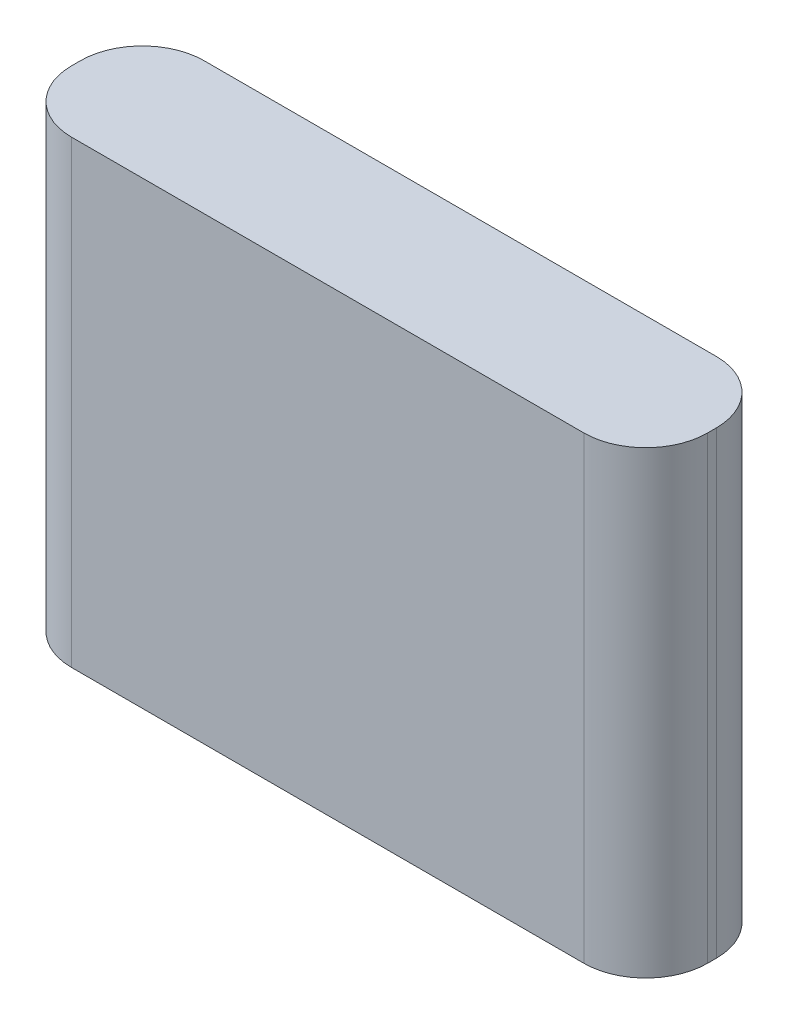
ISO-10303-21;
HEADER;
FILE_DESCRIPTION(('STEP AP214'),'2;1');
FILE_NAME('part.step','',(''),(''),'','','');
FILE_SCHEMA(('AUTOMOTIVE_DESIGN { 1 0 10303 214 1 1 1 1 }'));
ENDSEC;
DATA;
#1=APPLICATION_CONTEXT('core data for automotive mechanical design processes');
#2=APPLICATION_PROTOCOL_DEFINITION('international standard','automotive_design',2000,#1);
#3=PRODUCT_CONTEXT('',#1,'mechanical');
#4=PRODUCT('Part','Part','',(#3));
#5=PRODUCT_RELATED_PRODUCT_CATEGORY('part','',(#4));
#6=PRODUCT_DEFINITION_FORMATION('','',#4);
#7=PRODUCT_DEFINITION_CONTEXT('part definition',#1,'design');
#8=PRODUCT_DEFINITION('design','',#6,#7);
#9=PRODUCT_DEFINITION_SHAPE('','',#8);
#10=(LENGTH_UNIT() NAMED_UNIT(*) SI_UNIT(.MILLI.,.METRE.));
#11=(NAMED_UNIT(*) PLANE_ANGLE_UNIT() SI_UNIT($,.RADIAN.));
#12=(NAMED_UNIT(*) SI_UNIT($,.STERADIAN.) SOLID_ANGLE_UNIT());
#13=UNCERTAINTY_MEASURE_WITH_UNIT(LENGTH_MEASURE(1.E-05),#10,'distance_accuracy_value','');
#14=(GEOMETRIC_REPRESENTATION_CONTEXT(3) GLOBAL_UNCERTAINTY_ASSIGNED_CONTEXT((#13)) GLOBAL_UNIT_ASSIGNED_CONTEXT((#10,
#11,#12)) REPRESENTATION_CONTEXT('',''));
#15=CARTESIAN_POINT('',(0.,0.,0.));
#16=DIRECTION('',(0.,0.,1.));
#17=DIRECTION('',(1.,0.,0.));
#18=AXIS2_PLACEMENT_3D('',#15,#16,#17);
#19=CARTESIAN_POINT('',(0.,0.,15.));
#20=DIRECTION('',(1.,0.,0.));
#21=DIRECTION('',(0.,0.,-1.));
#22=AXIS2_PLACEMENT_3D('',#19,#20,#21);
#23=PLANE('',#22);
#24=DIRECTION('',(0.,0.,-1.));
#25=VECTOR('',#24,1.);
#26=CARTESIAN_POINT('',(0.,52.,15.));
#27=LINE('',#26,#25);
#28=CARTESIAN_POINT('',(0.,52.,8.));
#29=VERTEX_POINT('',#28);
#30=CARTESIAN_POINT('',(0.,52.,7.));
#31=VERTEX_POINT('',#30);
#32=EDGE_CURVE('E162',#29,#31,#27,.T.);
#33=ORIENTED_EDGE('',*,*,#32,.T.);
#34=DIRECTION('',(0.,-1.,0.));
#35=VECTOR('',#34,1.);
#36=CARTESIAN_POINT('',(0.,0.,7.));
#37=LINE('',#36,#35);
#38=CARTESIAN_POINT('',(0.,0.,7.));
#39=VERTEX_POINT('',#38);
#40=EDGE_CURVE('E118',#31,#39,#37,.T.);
#41=ORIENTED_EDGE('',*,*,#40,.T.);
#42=DIRECTION('',(0.,0.,-1.));
#43=VECTOR('',#42,1.);
#44=CARTESIAN_POINT('',(0.,0.,15.));
#45=LINE('',#44,#43);
#46=CARTESIAN_POINT('',(0.,0.,8.));
#47=VERTEX_POINT('',#46);
#48=EDGE_CURVE('E102',#47,#39,#45,.T.);
#49=ORIENTED_EDGE('',*,*,#48,.F.);
#50=DIRECTION('',(0.,-1.,0.));
#51=VECTOR('',#50,1.);
#52=CARTESIAN_POINT('',(0.,0.,8.));
#53=LINE('',#52,#51);
#54=EDGE_CURVE('E115',#47,#29,#53,.F.);
#55=ORIENTED_EDGE('',*,*,#54,.T.);
#56=EDGE_LOOP('',(#33,#41,#49,#55));
#57=FACE_BOUND('',#56,.T.);
#58=ADVANCED_FACE('F33',(#57),#23,.F.);
#59=CARTESIAN_POINT('',(0.,0.,15.));
#60=DIRECTION('',(0.,1.,0.));
#61=DIRECTION('',(0.,0.,1.));
#62=AXIS2_PLACEMENT_3D('',#59,#60,#61);
#63=PLANE('',#62);
#64=ORIENTED_EDGE('',*,*,#48,.T.);
#65=CARTESIAN_POINT('',(7.,0.,7.));
#66=DIRECTION('',(0.,1.,0.));
#67=DIRECTION('',(0.,0.,1.));
#68=AXIS2_PLACEMENT_3D('',#65,#66,#67);
#69=CIRCLE('',#68,7.);
#70=CARTESIAN_POINT('',(7.,0.,0.));
#71=VERTEX_POINT('',#70);
#72=EDGE_CURVE('E109',#39,#71,#69,.F.);
#73=ORIENTED_EDGE('',*,*,#72,.T.);
#74=DIRECTION('',(1.,0.,0.));
#75=VECTOR('',#74,1.);
#76=CARTESIAN_POINT('',(0.,0.,0.));
#77=LINE('',#76,#75);
#78=CARTESIAN_POINT('',(65.,0.,0.));
#79=VERTEX_POINT('',#78);
#80=EDGE_CURVE('E168',#71,#79,#77,.T.);
#81=ORIENTED_EDGE('',*,*,#80,.T.);
#82=CARTESIAN_POINT('',(65.,0.,7.));
#83=DIRECTION('',(0.,1.,0.));
#84=DIRECTION('',(0.,0.,1.));
#85=AXIS2_PLACEMENT_3D('',#82,#83,#84);
#86=CIRCLE('',#85,7.);
#87=CARTESIAN_POINT('',(72.,0.,7.));
#88=VERTEX_POINT('',#87);
#89=EDGE_CURVE('E110',#79,#88,#86,.F.);
#90=ORIENTED_EDGE('',*,*,#89,.T.);
#91=DIRECTION('',(0.,0.,-1.));
#92=VECTOR('',#91,1.);
#93=CARTESIAN_POINT('',(72.,0.,15.));
#94=LINE('',#93,#92);
#95=CARTESIAN_POINT('',(72.,0.,8.));
#96=VERTEX_POINT('',#95);
#97=EDGE_CURVE('E119',#96,#88,#94,.T.);
#98=ORIENTED_EDGE('',*,*,#97,.F.);
#99=CARTESIAN_POINT('',(65.,0.,8.));
#100=DIRECTION('',(0.,1.,0.));
#101=DIRECTION('',(0.,0.,1.));
#102=AXIS2_PLACEMENT_3D('',#99,#100,#101);
#103=CIRCLE('',#102,7.);
#104=CARTESIAN_POINT('',(65.,0.,15.));
#105=VERTEX_POINT('',#104);
#106=EDGE_CURVE('E125',#96,#105,#103,.F.);
#107=ORIENTED_EDGE('',*,*,#106,.T.);
#108=DIRECTION('',(1.,0.,0.));
#109=VECTOR('',#108,1.);
#110=CARTESIAN_POINT('',(0.,0.,15.));
#111=LINE('',#110,#109);
#112=CARTESIAN_POINT('',(7.,0.,15.));
#113=VERTEX_POINT('',#112);
#114=EDGE_CURVE('E104',#113,#105,#111,.T.);
#115=ORIENTED_EDGE('',*,*,#114,.F.);
#116=CARTESIAN_POINT('',(7.,0.,8.));
#117=DIRECTION('',(0.,1.,0.));
#118=DIRECTION('',(0.,0.,1.));
#119=AXIS2_PLACEMENT_3D('',#116,#117,#118);
#120=CIRCLE('',#119,7.);
#121=EDGE_CURVE('E99',#113,#47,#120,.F.);
#122=ORIENTED_EDGE('',*,*,#121,.T.);
#123=EDGE_LOOP('',(#64,#73,#81,#90,#98,#107,#115,#122));
#124=FACE_BOUND('',#123,.T.);
#125=ADVANCED_FACE('F101',(#124),#63,.F.);
#126=CARTESIAN_POINT('',(72.,0.,15.));
#127=DIRECTION('',(-1.,0.,0.));
#128=DIRECTION('',(0.,0.,1.));
#129=AXIS2_PLACEMENT_3D('',#126,#127,#128);
#130=PLANE('',#129);
#131=ORIENTED_EDGE('',*,*,#97,.T.);
#132=DIRECTION('',(0.,1.,0.));
#133=VECTOR('',#132,1.);
#134=CARTESIAN_POINT('',(72.,52.,7.));
#135=LINE('',#134,#133);
#136=CARTESIAN_POINT('',(72.,52.,7.));
#137=VERTEX_POINT('',#136);
#138=EDGE_CURVE('E11',#88,#137,#135,.T.);
#139=ORIENTED_EDGE('',*,*,#138,.T.);
#140=DIRECTION('',(0.,0.,-1.));
#141=VECTOR('',#140,1.);
#142=CARTESIAN_POINT('',(72.,52.,15.));
#143=LINE('',#142,#141);
#144=CARTESIAN_POINT('',(72.,52.,8.));
#145=VERTEX_POINT('',#144);
#146=EDGE_CURVE('E150',#145,#137,#143,.T.);
#147=ORIENTED_EDGE('',*,*,#146,.F.);
#148=DIRECTION('',(0.,1.,0.));
#149=VECTOR('',#148,1.);
#150=CARTESIAN_POINT('',(72.,0.,8.));
#151=LINE('',#150,#149);
#152=EDGE_CURVE('E41',#145,#96,#151,.F.);
#153=ORIENTED_EDGE('',*,*,#152,.T.);
#154=EDGE_LOOP('',(#131,#139,#147,#153));
#155=FACE_BOUND('',#154,.T.);
#156=ADVANCED_FACE('F149',(#155),#130,.F.);
#157=CARTESIAN_POINT('',(0.,52.,15.));
#158=DIRECTION('',(0.,-1.,0.));
#159=DIRECTION('',(0.,0.,-1.));
#160=AXIS2_PLACEMENT_3D('',#157,#158,#159);
#161=PLANE('',#160);
#162=DIRECTION('',(-1.,0.,0.));
#163=VECTOR('',#162,1.);
#164=CARTESIAN_POINT('',(0.,52.,0.));
#165=LINE('',#164,#163);
#166=CARTESIAN_POINT('',(65.,52.,0.));
#167=VERTEX_POINT('',#166);
#168=CARTESIAN_POINT('',(7.,52.,0.));
#169=VERTEX_POINT('',#168);
#170=EDGE_CURVE('E165',#167,#169,#165,.T.);
#171=ORIENTED_EDGE('',*,*,#170,.T.);
#172=CARTESIAN_POINT('',(7.,52.,7.));
#173=DIRECTION('',(0.,-1.,0.));
#174=DIRECTION('',(0.,0.,-1.));
#175=AXIS2_PLACEMENT_3D('',#172,#173,#174);
#176=CIRCLE('',#175,7.);
#177=EDGE_CURVE('E139',#169,#31,#176,.F.);
#178=ORIENTED_EDGE('',*,*,#177,.T.);
#179=ORIENTED_EDGE('',*,*,#32,.F.);
#180=CARTESIAN_POINT('',(7.,52.,8.));
#181=DIRECTION('',(0.,-1.,0.));
#182=DIRECTION('',(0.,0.,-1.));
#183=AXIS2_PLACEMENT_3D('',#180,#181,#182);
#184=CIRCLE('',#183,7.);
#185=CARTESIAN_POINT('',(7.,52.,15.));
#186=VERTEX_POINT('',#185);
#187=EDGE_CURVE('E123',#29,#186,#184,.F.);
#188=ORIENTED_EDGE('',*,*,#187,.T.);
#189=DIRECTION('',(-1.,0.,0.));
#190=VECTOR('',#189,1.);
#191=CARTESIAN_POINT('',(0.,52.,15.));
#192=LINE('',#191,#190);
#193=CARTESIAN_POINT('',(65.,52.,15.));
#194=VERTEX_POINT('',#193);
#195=EDGE_CURVE('E159',#194,#186,#192,.T.);
#196=ORIENTED_EDGE('',*,*,#195,.F.);
#197=CARTESIAN_POINT('',(65.,52.,8.));
#198=DIRECTION('',(0.,-1.,0.));
#199=DIRECTION('',(0.,0.,-1.));
#200=AXIS2_PLACEMENT_3D('',#197,#198,#199);
#201=CIRCLE('',#200,7.);
#202=EDGE_CURVE('E55',#194,#145,#201,.F.);
#203=ORIENTED_EDGE('',*,*,#202,.T.);
#204=ORIENTED_EDGE('',*,*,#146,.T.);
#205=CARTESIAN_POINT('',(65.,52.,7.));
#206=DIRECTION('',(0.,-1.,0.));
#207=DIRECTION('',(0.,0.,-1.));
#208=AXIS2_PLACEMENT_3D('',#205,#206,#207);
#209=CIRCLE('',#208,7.);
#210=EDGE_CURVE('E48',#137,#167,#209,.F.);
#211=ORIENTED_EDGE('',*,*,#210,.T.);
#212=EDGE_LOOP('',(#171,#178,#179,#188,#196,#203,#204,#211));
#213=FACE_BOUND('',#212,.T.);
#214=ADVANCED_FACE('F161',(#213),#161,.F.);
#215=CARTESIAN_POINT('',(0.,0.,15.));
#216=DIRECTION('',(0.,0.,-1.));
#217=DIRECTION('',(-1.,0.,0.));
#218=AXIS2_PLACEMENT_3D('',#215,#216,#217);
#219=PLANE('',#218);
#220=ORIENTED_EDGE('',*,*,#195,.T.);
#221=DIRECTION('',(0.,-1.,0.));
#222=VECTOR('',#221,1.);
#223=CARTESIAN_POINT('',(7.,0.,15.));
#224=LINE('',#223,#222);
#225=EDGE_CURVE('E144',#186,#113,#224,.T.);
#226=ORIENTED_EDGE('',*,*,#225,.T.);
#227=ORIENTED_EDGE('',*,*,#114,.T.);
#228=DIRECTION('',(0.,1.,0.));
#229=VECTOR('',#228,1.);
#230=CARTESIAN_POINT('',(65.,0.,15.));
#231=LINE('',#230,#229);
#232=EDGE_CURVE('E141',#105,#194,#231,.T.);
#233=ORIENTED_EDGE('',*,*,#232,.T.);
#234=EDGE_LOOP('',(#220,#226,#227,#233));
#235=FACE_BOUND('',#234,.T.);
#236=ADVANCED_FACE('F158',(#235),#219,.F.);
#237=CARTESIAN_POINT('',(0.,0.,0.));
#238=DIRECTION('',(0.,0.,-1.));
#239=DIRECTION('',(-1.,0.,0.));
#240=AXIS2_PLACEMENT_3D('',#237,#238,#239);
#241=PLANE('',#240);
#242=ORIENTED_EDGE('',*,*,#80,.F.);
#243=DIRECTION('',(0.,-1.,0.));
#244=VECTOR('',#243,1.);
#245=CARTESIAN_POINT('',(7.,52.,0.));
#246=LINE('',#245,#244);
#247=EDGE_CURVE('E134',#71,#169,#246,.F.);
#248=ORIENTED_EDGE('',*,*,#247,.T.);
#249=ORIENTED_EDGE('',*,*,#170,.F.);
#250=DIRECTION('',(0.,1.,0.));
#251=VECTOR('',#250,1.);
#252=CARTESIAN_POINT('',(65.,0.,0.));
#253=LINE('',#252,#251);
#254=EDGE_CURVE('E132',#167,#79,#253,.F.);
#255=ORIENTED_EDGE('',*,*,#254,.T.);
#256=EDGE_LOOP('',(#242,#248,#249,#255));
#257=FACE_BOUND('',#256,.T.);
#258=ADVANCED_FACE('F175',(#257),#241,.T.);
#259=CARTESIAN_POINT('',(7.,0.,7.));
#260=DIRECTION('',(0.,1.,0.));
#261=DIRECTION('',(0.,0.,1.));
#262=AXIS2_PLACEMENT_3D('',#259,#260,#261);
#263=CYLINDRICAL_SURFACE('',#262,7.);
#264=ORIENTED_EDGE('',*,*,#177,.F.);
#265=ORIENTED_EDGE('',*,*,#247,.F.);
#266=ORIENTED_EDGE('',*,*,#72,.F.);
#267=ORIENTED_EDGE('',*,*,#40,.F.);
#268=EDGE_LOOP('',(#264,#265,#266,#267));
#269=FACE_BOUND('',#268,.T.);
#270=ADVANCED_FACE('F183',(#269),#263,.T.);
#271=CARTESIAN_POINT('',(7.,0.,8.));
#272=DIRECTION('',(0.,-1.,0.));
#273=DIRECTION('',(0.,0.,-1.));
#274=AXIS2_PLACEMENT_3D('',#271,#272,#273);
#275=CYLINDRICAL_SURFACE('',#274,7.);
#276=ORIENTED_EDGE('',*,*,#187,.F.);
#277=ORIENTED_EDGE('',*,*,#54,.F.);
#278=ORIENTED_EDGE('',*,*,#121,.F.);
#279=ORIENTED_EDGE('',*,*,#225,.F.);
#280=EDGE_LOOP('',(#276,#277,#278,#279));
#281=FACE_BOUND('',#280,.T.);
#282=ADVANCED_FACE('F122',(#281),#275,.T.);
#283=CARTESIAN_POINT('',(65.,0.,7.));
#284=DIRECTION('',(0.,-1.,0.));
#285=DIRECTION('',(0.,0.,-1.));
#286=AXIS2_PLACEMENT_3D('',#283,#284,#285);
#287=CYLINDRICAL_SURFACE('',#286,7.);
#288=ORIENTED_EDGE('',*,*,#89,.F.);
#289=ORIENTED_EDGE('',*,*,#254,.F.);
#290=ORIENTED_EDGE('',*,*,#210,.F.);
#291=ORIENTED_EDGE('',*,*,#138,.F.);
#292=EDGE_LOOP('',(#288,#289,#290,#291));
#293=FACE_BOUND('',#292,.T.);
#294=ADVANCED_FACE('F177',(#293),#287,.T.);
#295=CARTESIAN_POINT('',(65.,0.,8.));
#296=DIRECTION('',(0.,1.,0.));
#297=DIRECTION('',(0.,0.,1.));
#298=AXIS2_PLACEMENT_3D('',#295,#296,#297);
#299=CYLINDRICAL_SURFACE('',#298,7.);
#300=ORIENTED_EDGE('',*,*,#106,.F.);
#301=ORIENTED_EDGE('',*,*,#152,.F.);
#302=ORIENTED_EDGE('',*,*,#202,.F.);
#303=ORIENTED_EDGE('',*,*,#232,.F.);
#304=EDGE_LOOP('',(#300,#301,#302,#303));
#305=FACE_BOUND('',#304,.T.);
#306=ADVANCED_FACE('F35',(#305),#299,.T.);
#307=CLOSED_SHELL('',(#58,#125,#156,#214,#236,#258,#270,#282,#294,#306));
#308=MANIFOLD_SOLID_BREP('B2',#307);
#309=ADVANCED_BREP_SHAPE_REPRESENTATION('',(#18,#308),#14);
#310=SHAPE_DEFINITION_REPRESENTATION(#9,#309);
ENDSEC;
END-ISO-10303-21;
